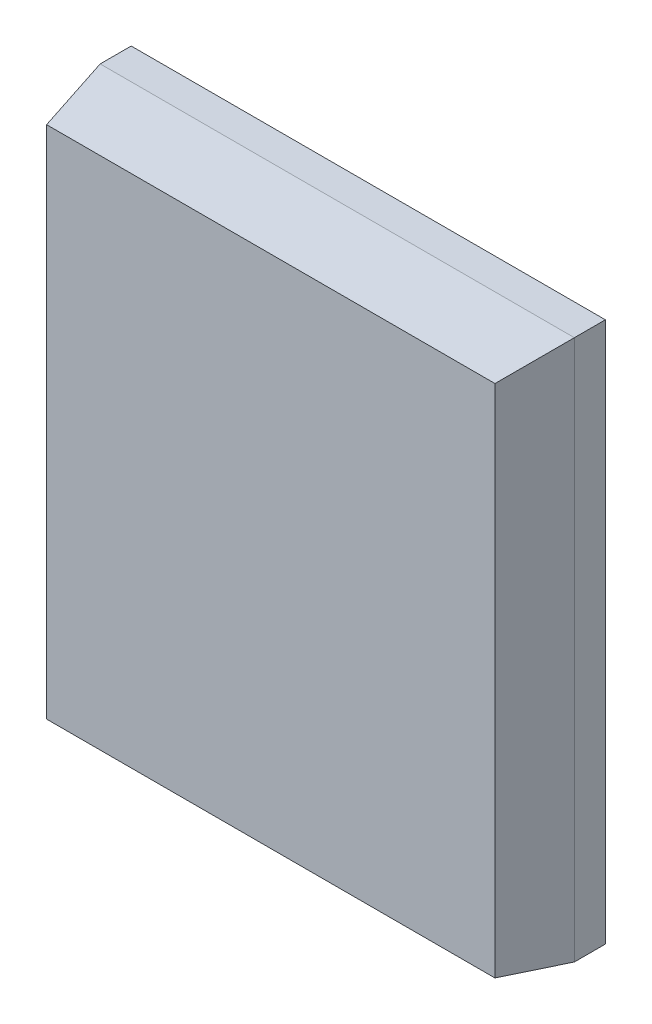
ISO-10303-21;
HEADER;
FILE_DESCRIPTION(('STEP AP214'),'2;1');
FILE_NAME('part.step','',(''),(''),'','','');
FILE_SCHEMA(('AUTOMOTIVE_DESIGN { 1 0 10303 214 1 1 1 1 }'));
ENDSEC;
DATA;
#1=APPLICATION_CONTEXT('core data for automotive mechanical design processes');
#2=APPLICATION_PROTOCOL_DEFINITION('international standard','automotive_design',2000,#1);
#3=PRODUCT_CONTEXT('',#1,'mechanical');
#4=PRODUCT('Part','Part','',(#3));
#5=PRODUCT_RELATED_PRODUCT_CATEGORY('part','',(#4));
#6=PRODUCT_DEFINITION_FORMATION('','',#4);
#7=PRODUCT_DEFINITION_CONTEXT('part definition',#1,'design');
#8=PRODUCT_DEFINITION('design','',#6,#7);
#9=PRODUCT_DEFINITION_SHAPE('','',#8);
#10=(LENGTH_UNIT() NAMED_UNIT(*) SI_UNIT(.MILLI.,.METRE.));
#11=(NAMED_UNIT(*) PLANE_ANGLE_UNIT() SI_UNIT($,.RADIAN.));
#12=(NAMED_UNIT(*) SI_UNIT($,.STERADIAN.) SOLID_ANGLE_UNIT());
#13=UNCERTAINTY_MEASURE_WITH_UNIT(LENGTH_MEASURE(1.E-05),#10,'distance_accuracy_value','');
#14=(GEOMETRIC_REPRESENTATION_CONTEXT(3) GLOBAL_UNCERTAINTY_ASSIGNED_CONTEXT((#13)) GLOBAL_UNIT_ASSIGNED_CONTEXT((#10,
#11,#12)) REPRESENTATION_CONTEXT('',''));
#15=CARTESIAN_POINT('',(0.,0.,0.));
#16=DIRECTION('',(0.,0.,1.));
#17=DIRECTION('',(1.,0.,0.));
#18=AXIS2_PLACEMENT_3D('',#15,#16,#17);
#19=CARTESIAN_POINT('',(-2.675,3.55,1.1));
#20=DIRECTION('',(0.,0.,1.));
#21=DIRECTION('',(1.,0.,0.));
#22=AXIS2_PLACEMENT_3D('',#19,#20,#21);
#23=PLANE('',#22);
#24=DIRECTION('',(1.,0.,0.));
#25=VECTOR('',#24,1.);
#26=CARTESIAN_POINT('',(2.675,3.40421476814643,1.09999999999989));
#27=LINE('',#26,#25);
#28=CARTESIAN_POINT('',(-2.52921476814686,3.40421476814686,1.09999999999994));
#29=VERTEX_POINT('',#28);
#30=CARTESIAN_POINT('',(2.52921476814686,3.40421476814686,1.09999999999994));
#31=VERTEX_POINT('',#30);
#32=EDGE_CURVE('E82',#29,#31,#27,.T.);
#33=ORIENTED_EDGE('',*,*,#32,.F.);
#34=DIRECTION('',(0.,1.,0.));
#35=VECTOR('',#34,1.);
#36=CARTESIAN_POINT('',(-2.52921476814643,3.55,1.09999999999989));
#37=LINE('',#36,#35);
#38=CARTESIAN_POINT('',(-2.52921476814686,-2.40421476814686,1.09999999999994));
#39=VERTEX_POINT('',#38);
#40=EDGE_CURVE('E20',#39,#29,#37,.T.);
#41=ORIENTED_EDGE('',*,*,#40,.F.);
#42=DIRECTION('',(1.,0.,0.));
#43=VECTOR('',#42,1.);
#44=CARTESIAN_POINT('',(-2.675,-2.40421476814643,1.09999999999989));
#45=LINE('',#44,#43);
#46=CARTESIAN_POINT('',(2.52921476814686,-2.40421476814686,1.09999999999994));
#47=VERTEX_POINT('',#46);
#48=EDGE_CURVE('E72',#47,#39,#45,.F.);
#49=ORIENTED_EDGE('',*,*,#48,.F.);
#50=DIRECTION('',(0.,1.,0.));
#51=VECTOR('',#50,1.);
#52=CARTESIAN_POINT('',(2.52921476814643,-2.55,1.09999999999989));
#53=LINE('',#52,#51);
#54=EDGE_CURVE('E67',#31,#47,#53,.F.);
#55=ORIENTED_EDGE('',*,*,#54,.F.);
#56=EDGE_LOOP('',(#33,#41,#49,#55));
#57=FACE_BOUND('',#56,.T.);
#58=ADVANCED_FACE('F17',(#57),#23,.T.);
#59=CARTESIAN_POINT('',(-2.675,3.55,0.35));
#60=DIRECTION('',(-0.981627183447591,0.,0.190808995376921));
#61=DIRECTION('',(0.190808995376921,0.,0.981627183447591));
#62=AXIS2_PLACEMENT_3D('',#59,#60,#61);
#63=PLANE('',#62);
#64=DIRECTION('',(0.,1.,0.));
#65=VECTOR('',#64,1.);
#66=CARTESIAN_POINT('',(-2.675,3.55,0.35));
#67=LINE('',#66,#65);
#68=CARTESIAN_POINT('',(-2.675,3.55,0.35));
#69=VERTEX_POINT('',#68);
#70=CARTESIAN_POINT('',(-2.675,-2.55,0.35));
#71=VERTEX_POINT('',#70);
#72=EDGE_CURVE('E87',#69,#71,#67,.F.);
#73=ORIENTED_EDGE('',*,*,#72,.T.);
#74=DIRECTION('',(-0.18742755999155,-0.187427559992277,-0.964231206459817));
#75=VECTOR('',#74,1.);
#76=CARTESIAN_POINT('',(-2.529214768147,-2.40421476814643,1.09999999999989));
#77=LINE('',#76,#75);
#78=EDGE_CURVE('E77',#39,#71,#77,.T.);
#79=ORIENTED_EDGE('',*,*,#78,.F.);
#80=ORIENTED_EDGE('',*,*,#40,.T.);
#81=DIRECTION('',(0.187427559991551,-0.187427559992277,0.964231206459817));
#82=VECTOR('',#81,1.);
#83=CARTESIAN_POINT('',(-2.675,3.55,0.35));
#84=LINE('',#83,#82);
#85=EDGE_CURVE('E96',#69,#29,#84,.T.);
#86=ORIENTED_EDGE('',*,*,#85,.F.);
#87=EDGE_LOOP('',(#73,#79,#80,#86));
#88=FACE_BOUND('',#87,.T.);
#89=ADVANCED_FACE('F86',(#88),#63,.T.);
#90=CARTESIAN_POINT('',(-2.675,-2.55,0.35));
#91=DIRECTION('',(0.,-0.981627183447591,0.190808995376921));
#92=DIRECTION('',(0.,-0.190808995376921,-0.981627183447591));
#93=AXIS2_PLACEMENT_3D('',#90,#91,#92);
#94=PLANE('',#93);
#95=DIRECTION('',(-1.,0.,0.));
#96=VECTOR('',#95,1.);
#97=CARTESIAN_POINT('',(-2.675,-2.55,0.35));
#98=LINE('',#97,#96);
#99=CARTESIAN_POINT('',(2.675,-2.55,0.35));
#100=VERTEX_POINT('',#99);
#101=EDGE_CURVE('E102',#71,#100,#98,.F.);
#102=ORIENTED_EDGE('',*,*,#101,.T.);
#103=DIRECTION('',(0.187427559992277,-0.18742755999155,-0.964231206459817));
#104=VECTOR('',#103,1.);
#105=CARTESIAN_POINT('',(2.52921476814643,-2.404214768147,1.09999999999989));
#106=LINE('',#105,#104);
#107=EDGE_CURVE('E79',#47,#100,#106,.T.);
#108=ORIENTED_EDGE('',*,*,#107,.F.);
#109=ORIENTED_EDGE('',*,*,#48,.T.);
#110=ORIENTED_EDGE('',*,*,#78,.T.);
#111=EDGE_LOOP('',(#102,#108,#109,#110));
#112=FACE_BOUND('',#111,.T.);
#113=ADVANCED_FACE('F75',(#112),#94,.T.);
#114=CARTESIAN_POINT('',(2.675,-2.55,0.35));
#115=DIRECTION('',(0.981627183447591,0.,0.190808995376921));
#116=DIRECTION('',(0.190808995376921,0.,-0.981627183447591));
#117=AXIS2_PLACEMENT_3D('',#114,#115,#116);
#118=PLANE('',#117);
#119=DIRECTION('',(0.,-1.,0.));
#120=VECTOR('',#119,1.);
#121=CARTESIAN_POINT('',(2.675,3.55,0.35));
#122=LINE('',#121,#120);
#123=CARTESIAN_POINT('',(2.675,3.55,0.35));
#124=VERTEX_POINT('',#123);
#125=EDGE_CURVE('E107',#100,#124,#122,.F.);
#126=ORIENTED_EDGE('',*,*,#125,.T.);
#127=DIRECTION('',(0.18742755999155,0.187427559992277,-0.964231206459817));
#128=VECTOR('',#127,1.);
#129=CARTESIAN_POINT('',(2.529214768147,3.40421476814643,1.09999999999989));
#130=LINE('',#129,#128);
#131=EDGE_CURVE('E94',#31,#124,#130,.T.);
#132=ORIENTED_EDGE('',*,*,#131,.F.);
#133=ORIENTED_EDGE('',*,*,#54,.T.);
#134=ORIENTED_EDGE('',*,*,#107,.T.);
#135=EDGE_LOOP('',(#126,#132,#133,#134));
#136=FACE_BOUND('',#135,.T.);
#137=ADVANCED_FACE('F154',(#136),#118,.T.);
#138=CARTESIAN_POINT('',(2.675,3.55,0.35));
#139=DIRECTION('',(0.,0.981627183447591,0.190808995376921));
#140=DIRECTION('',(0.,-0.190808995376921,0.981627183447591));
#141=AXIS2_PLACEMENT_3D('',#138,#139,#140);
#142=PLANE('',#141);
#143=DIRECTION('',(1.,0.,0.));
#144=VECTOR('',#143,1.);
#145=CARTESIAN_POINT('',(-2.675,3.55,0.35));
#146=LINE('',#145,#144);
#147=EDGE_CURVE('E111',#124,#69,#146,.F.);
#148=ORIENTED_EDGE('',*,*,#147,.T.);
#149=ORIENTED_EDGE('',*,*,#85,.T.);
#150=ORIENTED_EDGE('',*,*,#32,.T.);
#151=ORIENTED_EDGE('',*,*,#131,.T.);
#152=EDGE_LOOP('',(#148,#149,#150,#151));
#153=FACE_BOUND('',#152,.T.);
#154=ADVANCED_FACE('F151',(#153),#142,.T.);
#155=CARTESIAN_POINT('',(-2.675,3.55,0.35));
#156=DIRECTION('',(1.,0.,0.));
#157=DIRECTION('',(0.,1.,0.));
#158=AXIS2_PLACEMENT_3D('',#155,#156,#157);
#159=PLANE('',#158);
#160=ORIENTED_EDGE('',*,*,#72,.F.);
#161=DIRECTION('',(0.,0.,1.));
#162=VECTOR('',#161,1.);
#163=CARTESIAN_POINT('',(-2.675,3.55,0.35));
#164=LINE('',#163,#162);
#165=CARTESIAN_POINT('',(-2.675,3.55,0.));
#166=VERTEX_POINT('',#165);
#167=EDGE_CURVE('E114',#69,#166,#164,.F.);
#168=ORIENTED_EDGE('',*,*,#167,.T.);
#169=DIRECTION('',(0.,1.,0.));
#170=VECTOR('',#169,1.);
#171=CARTESIAN_POINT('',(-2.675,-2.55,0.));
#172=LINE('',#171,#170);
#173=CARTESIAN_POINT('',(-2.675,-2.55,0.));
#174=VERTEX_POINT('',#173);
#175=EDGE_CURVE('E117',#166,#174,#172,.F.);
#176=ORIENTED_EDGE('',*,*,#175,.T.);
#177=DIRECTION('',(0.,0.,1.));
#178=VECTOR('',#177,1.);
#179=CARTESIAN_POINT('',(-2.675,-2.55,0.35));
#180=LINE('',#179,#178);
#181=EDGE_CURVE('E99',#174,#71,#180,.T.);
#182=ORIENTED_EDGE('',*,*,#181,.T.);
#183=EDGE_LOOP('',(#160,#168,#176,#182));
#184=FACE_BOUND('',#183,.T.);
#185=ADVANCED_FACE('F134',(#184),#159,.F.);
#186=CARTESIAN_POINT('',(-2.675,-2.55,0.35));
#187=DIRECTION('',(0.,1.,0.));
#188=DIRECTION('',(-1.,0.,0.));
#189=AXIS2_PLACEMENT_3D('',#186,#187,#188);
#190=PLANE('',#189);
#191=ORIENTED_EDGE('',*,*,#101,.F.);
#192=ORIENTED_EDGE('',*,*,#181,.F.);
#193=DIRECTION('',(1.,0.,0.));
#194=VECTOR('',#193,1.);
#195=CARTESIAN_POINT('',(-2.675,-2.55,0.));
#196=LINE('',#195,#194);
#197=CARTESIAN_POINT('',(2.675,-2.55,0.));
#198=VERTEX_POINT('',#197);
#199=EDGE_CURVE('E120',#174,#198,#196,.T.);
#200=ORIENTED_EDGE('',*,*,#199,.T.);
#201=DIRECTION('',(0.,0.,1.));
#202=VECTOR('',#201,1.);
#203=CARTESIAN_POINT('',(2.675,-2.55,0.35));
#204=LINE('',#203,#202);
#205=EDGE_CURVE('E104',#198,#100,#204,.T.);
#206=ORIENTED_EDGE('',*,*,#205,.T.);
#207=EDGE_LOOP('',(#191,#192,#200,#206));
#208=FACE_BOUND('',#207,.T.);
#209=ADVANCED_FACE('F132',(#208),#190,.F.);
#210=CARTESIAN_POINT('',(2.675,3.55,0.35));
#211=DIRECTION('',(-1.,0.,0.));
#212=DIRECTION('',(0.,-1.,0.));
#213=AXIS2_PLACEMENT_3D('',#210,#211,#212);
#214=PLANE('',#213);
#215=ORIENTED_EDGE('',*,*,#125,.F.);
#216=ORIENTED_EDGE('',*,*,#205,.F.);
#217=DIRECTION('',(0.,1.,0.));
#218=VECTOR('',#217,1.);
#219=CARTESIAN_POINT('',(2.675,-2.55,0.));
#220=LINE('',#219,#218);
#221=CARTESIAN_POINT('',(2.675,3.55,0.));
#222=VERTEX_POINT('',#221);
#223=EDGE_CURVE('E26',#198,#222,#220,.T.);
#224=ORIENTED_EDGE('',*,*,#223,.T.);
#225=DIRECTION('',(0.,0.,1.));
#226=VECTOR('',#225,1.);
#227=CARTESIAN_POINT('',(2.675,3.55,0.35));
#228=LINE('',#227,#226);
#229=EDGE_CURVE('E34',#222,#124,#228,.T.);
#230=ORIENTED_EDGE('',*,*,#229,.T.);
#231=EDGE_LOOP('',(#215,#216,#224,#230));
#232=FACE_BOUND('',#231,.T.);
#233=ADVANCED_FACE('F127',(#232),#214,.F.);
#234=CARTESIAN_POINT('',(-2.675,3.55,0.35));
#235=DIRECTION('',(0.,-1.,0.));
#236=DIRECTION('',(1.,0.,0.));
#237=AXIS2_PLACEMENT_3D('',#234,#235,#236);
#238=PLANE('',#237);
#239=ORIENTED_EDGE('',*,*,#147,.F.);
#240=ORIENTED_EDGE('',*,*,#229,.F.);
#241=DIRECTION('',(1.,0.,0.));
#242=VECTOR('',#241,1.);
#243=CARTESIAN_POINT('',(-2.675,3.55,0.));
#244=LINE('',#243,#242);
#245=EDGE_CURVE('E11',#222,#166,#244,.F.);
#246=ORIENTED_EDGE('',*,*,#245,.T.);
#247=ORIENTED_EDGE('',*,*,#167,.F.);
#248=EDGE_LOOP('',(#239,#240,#246,#247));
#249=FACE_BOUND('',#248,.T.);
#250=ADVANCED_FACE('F136',(#249),#238,.F.);
#251=CARTESIAN_POINT('',(-2.675,-2.55,0.));
#252=DIRECTION('',(0.,0.,1.));
#253=DIRECTION('',(1.,0.,0.));
#254=AXIS2_PLACEMENT_3D('',#251,#252,#253);
#255=PLANE('',#254);
#256=ORIENTED_EDGE('',*,*,#223,.F.);
#257=ORIENTED_EDGE('',*,*,#199,.F.);
#258=ORIENTED_EDGE('',*,*,#175,.F.);
#259=ORIENTED_EDGE('',*,*,#245,.F.);
#260=EDGE_LOOP('',(#256,#257,#258,#259));
#261=FACE_BOUND('',#260,.T.);
#262=ADVANCED_FACE('F130',(#261),#255,.F.);
#263=CLOSED_SHELL('',(#58,#89,#113,#137,#154,#185,#209,#233,#250,#262));
#264=MANIFOLD_SOLID_BREP('B1',#263);
#265=ADVANCED_BREP_SHAPE_REPRESENTATION('',(#18,#264),#14);
#266=SHAPE_DEFINITION_REPRESENTATION(#9,#265);
ENDSEC;
END-ISO-10303-21;
